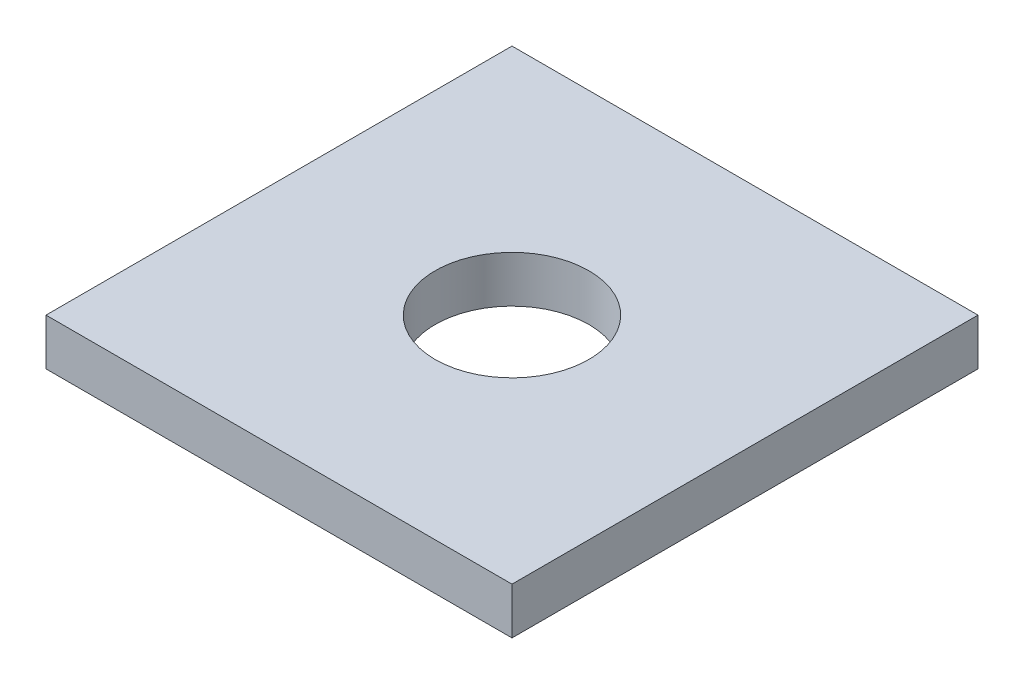
ISO-10303-21;
HEADER;
FILE_DESCRIPTION(('STEP AP214'),'2;1');
FILE_NAME('part.step','',(''),(''),'','','');
FILE_SCHEMA(('AUTOMOTIVE_DESIGN { 1 0 10303 214 1 1 1 1 }'));
ENDSEC;
DATA;
#1=APPLICATION_CONTEXT('core data for automotive mechanical design processes');
#2=APPLICATION_PROTOCOL_DEFINITION('international standard','automotive_design',2000,#1);
#3=PRODUCT_CONTEXT('',#1,'mechanical');
#4=PRODUCT('Part','Part','',(#3));
#5=PRODUCT_RELATED_PRODUCT_CATEGORY('part','',(#4));
#6=PRODUCT_DEFINITION_FORMATION('','',#4);
#7=PRODUCT_DEFINITION_CONTEXT('part definition',#1,'design');
#8=PRODUCT_DEFINITION('design','',#6,#7);
#9=PRODUCT_DEFINITION_SHAPE('','',#8);
#10=(LENGTH_UNIT() NAMED_UNIT(*) SI_UNIT(.MILLI.,.METRE.));
#11=(NAMED_UNIT(*) PLANE_ANGLE_UNIT() SI_UNIT($,.RADIAN.));
#12=(NAMED_UNIT(*) SI_UNIT($,.STERADIAN.) SOLID_ANGLE_UNIT());
#13=UNCERTAINTY_MEASURE_WITH_UNIT(LENGTH_MEASURE(1.E-05),#10,'distance_accuracy_value','');
#14=(GEOMETRIC_REPRESENTATION_CONTEXT(3) GLOBAL_UNCERTAINTY_ASSIGNED_CONTEXT((#13)) GLOBAL_UNIT_ASSIGNED_CONTEXT((#10,
#11,#12)) REPRESENTATION_CONTEXT('',''));
#15=CARTESIAN_POINT('',(0.,0.,0.));
#16=DIRECTION('',(0.,0.,1.));
#17=DIRECTION('',(1.,0.,0.));
#18=AXIS2_PLACEMENT_3D('',#15,#16,#17);
#19=CARTESIAN_POINT('',(0.,0.,0.));
#20=DIRECTION('',(0.,-1.,0.));
#21=DIRECTION('',(0.,0.,-1.));
#22=AXIS2_PLACEMENT_3D('',#19,#20,#21);
#23=PLANE('',#22);
#24=DIRECTION('',(0.,0.,-1.));
#25=VECTOR('',#24,1.);
#26=CARTESIAN_POINT('',(50.,0.,50.));
#27=LINE('',#26,#25);
#28=CARTESIAN_POINT('',(50.,0.,50.));
#29=VERTEX_POINT('',#28);
#30=CARTESIAN_POINT('',(50.,0.,-50.));
#31=VERTEX_POINT('',#30);
#32=EDGE_CURVE('E200',#29,#31,#27,.T.);
#33=ORIENTED_EDGE('',*,*,#32,.F.);
#34=DIRECTION('',(1.,0.,0.));
#35=VECTOR('',#34,1.);
#36=CARTESIAN_POINT('',(-50.,0.,50.));
#37=LINE('',#36,#35);
#38=CARTESIAN_POINT('',(-50.,0.,50.));
#39=VERTEX_POINT('',#38);
#40=EDGE_CURVE('E206',#39,#29,#37,.T.);
#41=ORIENTED_EDGE('',*,*,#40,.F.);
#42=DIRECTION('',(0.,0.,1.));
#43=VECTOR('',#42,1.);
#44=CARTESIAN_POINT('',(-50.,0.,50.));
#45=LINE('',#44,#43);
#46=CARTESIAN_POINT('',(-50.,0.,-50.));
#47=VERTEX_POINT('',#46);
#48=EDGE_CURVE('E220',#47,#39,#45,.T.);
#49=ORIENTED_EDGE('',*,*,#48,.F.);
#50=DIRECTION('',(-1.,0.,0.));
#51=VECTOR('',#50,1.);
#52=CARTESIAN_POINT('',(-50.,0.,-50.));
#53=LINE('',#52,#51);
#54=EDGE_CURVE('E214',#31,#47,#53,.T.);
#55=ORIENTED_EDGE('',*,*,#54,.F.);
#56=EDGE_LOOP('',(#33,#41,#49,#55));
#57=FACE_BOUND('',#56,.T.);
#58=DIRECTION('',(-1.,0.,0.));
#59=VECTOR('',#58,1.);
#60=CARTESIAN_POINT('',(-40.,0.,40.));
#61=LINE('',#60,#59);
#62=CARTESIAN_POINT('',(40.,0.,40.));
#63=VERTEX_POINT('',#62);
#64=CARTESIAN_POINT('',(-40.,0.,40.));
#65=VERTEX_POINT('',#64);
#66=EDGE_CURVE('E185',#63,#65,#61,.T.);
#67=ORIENTED_EDGE('',*,*,#66,.F.);
#68=DIRECTION('',(0.,0.,1.));
#69=VECTOR('',#68,1.);
#70=CARTESIAN_POINT('',(40.,0.,-40.));
#71=LINE('',#70,#69);
#72=CARTESIAN_POINT('',(40.,0.,-40.));
#73=VERTEX_POINT('',#72);
#74=EDGE_CURVE('E150',#73,#63,#71,.T.);
#75=ORIENTED_EDGE('',*,*,#74,.F.);
#76=DIRECTION('',(1.,0.,0.));
#77=VECTOR('',#76,1.);
#78=CARTESIAN_POINT('',(-40.,0.,-40.));
#79=LINE('',#78,#77);
#80=CARTESIAN_POINT('',(-40.,0.,-40.));
#81=VERTEX_POINT('',#80);
#82=EDGE_CURVE('E174',#81,#73,#79,.T.);
#83=ORIENTED_EDGE('',*,*,#82,.F.);
#84=DIRECTION('',(0.,0.,-1.));
#85=VECTOR('',#84,1.);
#86=CARTESIAN_POINT('',(-40.,0.,-40.));
#87=LINE('',#86,#85);
#88=EDGE_CURVE('E184',#65,#81,#87,.T.);
#89=ORIENTED_EDGE('',*,*,#88,.F.);
#90=EDGE_LOOP('',(#67,#75,#83,#89));
#91=FACE_BOUND('',#90,.T.);
#92=ADVANCED_FACE('F39',(#57,#91),#23,.T.);
#93=CARTESIAN_POINT('',(0.,10.,0.));
#94=DIRECTION('',(0.,-1.,0.));
#95=DIRECTION('',(0.,0.,-1.));
#96=AXIS2_PLACEMENT_3D('',#93,#94,#95);
#97=PLANE('',#96);
#98=DIRECTION('',(0.,0.,-1.));
#99=VECTOR('',#98,1.);
#100=CARTESIAN_POINT('',(50.,10.,50.));
#101=LINE('',#100,#99);
#102=CARTESIAN_POINT('',(50.,10.,50.));
#103=VERTEX_POINT('',#102);
#104=CARTESIAN_POINT('',(50.,10.,-50.));
#105=VERTEX_POINT('',#104);
#106=EDGE_CURVE('E205',#103,#105,#101,.T.);
#107=ORIENTED_EDGE('',*,*,#106,.T.);
#108=DIRECTION('',(-1.,0.,0.));
#109=VECTOR('',#108,1.);
#110=CARTESIAN_POINT('',(-50.,10.,-50.));
#111=LINE('',#110,#109);
#112=CARTESIAN_POINT('',(-50.,10.,-50.));
#113=VERTEX_POINT('',#112);
#114=EDGE_CURVE('E202',#105,#113,#111,.T.);
#115=ORIENTED_EDGE('',*,*,#114,.T.);
#116=DIRECTION('',(0.,0.,1.));
#117=VECTOR('',#116,1.);
#118=CARTESIAN_POINT('',(-50.,10.,50.));
#119=LINE('',#118,#117);
#120=CARTESIAN_POINT('',(-50.,10.,50.));
#121=VERTEX_POINT('',#120);
#122=EDGE_CURVE('E208',#113,#121,#119,.T.);
#123=ORIENTED_EDGE('',*,*,#122,.T.);
#124=DIRECTION('',(1.,0.,0.));
#125=VECTOR('',#124,1.);
#126=CARTESIAN_POINT('',(-50.,10.,50.));
#127=LINE('',#126,#125);
#128=EDGE_CURVE('E209',#121,#103,#127,.T.);
#129=ORIENTED_EDGE('',*,*,#128,.T.);
#130=EDGE_LOOP('',(#107,#115,#123,#129));
#131=FACE_BOUND('',#130,.T.);
#132=CARTESIAN_POINT('',(0.,10.,0.));
#133=DIRECTION('',(0.,1.,0.));
#134=DIRECTION('',(0.,0.,1.));
#135=AXIS2_PLACEMENT_3D('',#132,#133,#134);
#136=CIRCLE('',#135,16.5);
#137=CARTESIAN_POINT('',(0.,10.,16.5));
#138=VERTEX_POINT('',#137);
#139=EDGE_CURVE('E198',#138,#138,#136,.T.);
#140=ORIENTED_EDGE('',*,*,#139,.F.);
#141=EDGE_LOOP('',(#140));
#142=FACE_BOUND('',#141,.T.);
#143=ADVANCED_FACE('F241',(#131,#142),#97,.F.);
#144=DIRECTION('',(0.,0.,-1.));
#145=VECTOR('',#144,1.);
#146=CARTESIAN_POINT('',(-36.,0.,-36.));
#147=LINE('',#146,#145);
#148=CARTESIAN_POINT('',(-36.,0.,36.));
#149=VERTEX_POINT('',#148);
#150=CARTESIAN_POINT('',(-36.,0.,-36.));
#151=VERTEX_POINT('',#150);
#152=EDGE_CURVE('E65',#149,#151,#147,.T.);
#153=ORIENTED_EDGE('',*,*,#152,.T.);
#154=DIRECTION('',(1.,0.,0.));
#155=VECTOR('',#154,1.);
#156=CARTESIAN_POINT('',(-36.,0.,-36.));
#157=LINE('',#156,#155);
#158=CARTESIAN_POINT('',(36.,0.,-36.));
#159=VERTEX_POINT('',#158);
#160=EDGE_CURVE('E148',#151,#159,#157,.T.);
#161=ORIENTED_EDGE('',*,*,#160,.T.);
#162=DIRECTION('',(0.,0.,1.));
#163=VECTOR('',#162,1.);
#164=CARTESIAN_POINT('',(36.,0.,-36.));
#165=LINE('',#164,#163);
#166=CARTESIAN_POINT('',(36.,0.,36.));
#167=VERTEX_POINT('',#166);
#168=EDGE_CURVE('E161',#159,#167,#165,.T.);
#169=ORIENTED_EDGE('',*,*,#168,.T.);
#170=DIRECTION('',(-1.,0.,0.));
#171=VECTOR('',#170,1.);
#172=CARTESIAN_POINT('',(-36.,0.,36.));
#173=LINE('',#172,#171);
#174=EDGE_CURVE('E139',#167,#149,#173,.T.);
#175=ORIENTED_EDGE('',*,*,#174,.T.);
#176=EDGE_LOOP('',(#153,#161,#169,#175));
#177=FACE_BOUND('',#176,.T.);
#178=CARTESIAN_POINT('',(0.,0.,0.));
#179=DIRECTION('',(0.,1.,0.));
#180=DIRECTION('',(0.,0.,1.));
#181=AXIS2_PLACEMENT_3D('',#178,#179,#180);
#182=CIRCLE('',#181,16.5);
#183=CARTESIAN_POINT('',(0.,0.,16.5));
#184=VERTEX_POINT('',#183);
#185=EDGE_CURVE('E194',#184,#184,#182,.T.);
#186=ORIENTED_EDGE('',*,*,#185,.T.);
#187=EDGE_LOOP('',(#186));
#188=FACE_BOUND('',#187,.T.);
#189=ADVANCED_FACE('F251',(#177,#188),#23,.T.);
#190=CARTESIAN_POINT('',(50.,10.,50.));
#191=DIRECTION('',(-1.,0.,0.));
#192=DIRECTION('',(0.,0.,1.));
#193=AXIS2_PLACEMENT_3D('',#190,#191,#192);
#194=PLANE('',#193);
#195=ORIENTED_EDGE('',*,*,#32,.T.);
#196=DIRECTION('',(0.,-1.,0.));
#197=VECTOR('',#196,1.);
#198=CARTESIAN_POINT('',(50.,10.,-50.));
#199=LINE('',#198,#197);
#200=EDGE_CURVE('E11',#105,#31,#199,.T.);
#201=ORIENTED_EDGE('',*,*,#200,.F.);
#202=ORIENTED_EDGE('',*,*,#106,.F.);
#203=DIRECTION('',(0.,-1.,0.));
#204=VECTOR('',#203,1.);
#205=CARTESIAN_POINT('',(50.,10.,50.));
#206=LINE('',#205,#204);
#207=EDGE_CURVE('E215',#103,#29,#206,.T.);
#208=ORIENTED_EDGE('',*,*,#207,.T.);
#209=EDGE_LOOP('',(#195,#201,#202,#208));
#210=FACE_BOUND('',#209,.T.);
#211=ADVANCED_FACE('F41',(#210),#194,.F.);
#212=CARTESIAN_POINT('',(-50.,10.,-50.));
#213=DIRECTION('',(0.,0.,1.));
#214=DIRECTION('',(1.,0.,0.));
#215=AXIS2_PLACEMENT_3D('',#212,#213,#214);
#216=PLANE('',#215);
#217=ORIENTED_EDGE('',*,*,#54,.T.);
#218=DIRECTION('',(0.,-1.,0.));
#219=VECTOR('',#218,1.);
#220=CARTESIAN_POINT('',(-50.,10.,-50.));
#221=LINE('',#220,#219);
#222=EDGE_CURVE('E50',#113,#47,#221,.T.);
#223=ORIENTED_EDGE('',*,*,#222,.F.);
#224=ORIENTED_EDGE('',*,*,#114,.F.);
#225=ORIENTED_EDGE('',*,*,#200,.T.);
#226=EDGE_LOOP('',(#217,#223,#224,#225));
#227=FACE_BOUND('',#226,.T.);
#228=ADVANCED_FACE('F248',(#227),#216,.F.);
#229=CARTESIAN_POINT('',(-50.,10.,50.));
#230=DIRECTION('',(1.,0.,0.));
#231=DIRECTION('',(0.,0.,-1.));
#232=AXIS2_PLACEMENT_3D('',#229,#230,#231);
#233=PLANE('',#232);
#234=ORIENTED_EDGE('',*,*,#48,.T.);
#235=DIRECTION('',(0.,-1.,0.));
#236=VECTOR('',#235,1.);
#237=CARTESIAN_POINT('',(-50.,10.,50.));
#238=LINE('',#237,#236);
#239=EDGE_CURVE('E225',#121,#39,#238,.T.);
#240=ORIENTED_EDGE('',*,*,#239,.F.);
#241=ORIENTED_EDGE('',*,*,#122,.F.);
#242=ORIENTED_EDGE('',*,*,#222,.T.);
#243=EDGE_LOOP('',(#234,#240,#241,#242));
#244=FACE_BOUND('',#243,.T.);
#245=ADVANCED_FACE('F226',(#244),#233,.F.);
#246=CARTESIAN_POINT('',(-50.,10.,50.));
#247=DIRECTION('',(0.,0.,-1.));
#248=DIRECTION('',(-1.,0.,0.));
#249=AXIS2_PLACEMENT_3D('',#246,#247,#248);
#250=PLANE('',#249);
#251=ORIENTED_EDGE('',*,*,#40,.T.);
#252=ORIENTED_EDGE('',*,*,#207,.F.);
#253=ORIENTED_EDGE('',*,*,#128,.F.);
#254=ORIENTED_EDGE('',*,*,#239,.T.);
#255=EDGE_LOOP('',(#251,#252,#253,#254));
#256=FACE_BOUND('',#255,.T.);
#257=ADVANCED_FACE('F236',(#256),#250,.F.);
#258=CARTESIAN_POINT('',(0.,10.,0.));
#259=DIRECTION('',(0.,-1.,0.));
#260=DIRECTION('',(0.,0.,-1.));
#261=AXIS2_PLACEMENT_3D('',#258,#259,#260);
#262=CYLINDRICAL_SURFACE('',#261,16.5);
#263=ORIENTED_EDGE('',*,*,#139,.T.);
#264=EDGE_LOOP('',(#263));
#265=FACE_BOUND('',#264,.T.);
#266=ORIENTED_EDGE('',*,*,#185,.F.);
#267=EDGE_LOOP('',(#266));
#268=FACE_BOUND('',#267,.T.);
#269=ADVANCED_FACE('F267',(#265,#268),#262,.F.);
#270=CARTESIAN_POINT('',(0.,-10.,0.));
#271=DIRECTION('',(0.,1.,0.));
#272=DIRECTION('',(0.,0.,1.));
#273=AXIS2_PLACEMENT_3D('',#270,#271,#272);
#274=PLANE('',#273);
#275=DIRECTION('',(0.,0.,1.));
#276=VECTOR('',#275,1.);
#277=CARTESIAN_POINT('',(40.,-10.,-40.));
#278=LINE('',#277,#276);
#279=CARTESIAN_POINT('',(40.,-10.,-40.));
#280=VERTEX_POINT('',#279);
#281=CARTESIAN_POINT('',(40.,-10.,40.));
#282=VERTEX_POINT('',#281);
#283=EDGE_CURVE('E166',#280,#282,#278,.T.);
#284=ORIENTED_EDGE('',*,*,#283,.T.);
#285=DIRECTION('',(-1.,0.,0.));
#286=VECTOR('',#285,1.);
#287=CARTESIAN_POINT('',(-40.,-10.,40.));
#288=LINE('',#287,#286);
#289=CARTESIAN_POINT('',(-40.,-10.,40.));
#290=VERTEX_POINT('',#289);
#291=EDGE_CURVE('E175',#282,#290,#288,.T.);
#292=ORIENTED_EDGE('',*,*,#291,.T.);
#293=DIRECTION('',(0.,0.,-1.));
#294=VECTOR('',#293,1.);
#295=CARTESIAN_POINT('',(-40.,-10.,-40.));
#296=LINE('',#295,#294);
#297=CARTESIAN_POINT('',(-40.,-10.,-40.));
#298=VERTEX_POINT('',#297);
#299=EDGE_CURVE('E173',#290,#298,#296,.T.);
#300=ORIENTED_EDGE('',*,*,#299,.T.);
#301=DIRECTION('',(1.,0.,0.));
#302=VECTOR('',#301,1.);
#303=CARTESIAN_POINT('',(-40.,-10.,-40.));
#304=LINE('',#303,#302);
#305=EDGE_CURVE('E180',#298,#280,#304,.T.);
#306=ORIENTED_EDGE('',*,*,#305,.T.);
#307=EDGE_LOOP('',(#284,#292,#300,#306));
#308=FACE_BOUND('',#307,.T.);
#309=DIRECTION('',(0.,0.,-1.));
#310=VECTOR('',#309,1.);
#311=CARTESIAN_POINT('',(-36.,-10.,-36.));
#312=LINE('',#311,#310);
#313=CARTESIAN_POINT('',(-36.,-10.,36.));
#314=VERTEX_POINT('',#313);
#315=CARTESIAN_POINT('',(-36.,-10.,-36.));
#316=VERTEX_POINT('',#315);
#317=EDGE_CURVE('E128',#314,#316,#312,.T.);
#318=ORIENTED_EDGE('',*,*,#317,.F.);
#319=DIRECTION('',(-1.,0.,0.));
#320=VECTOR('',#319,1.);
#321=CARTESIAN_POINT('',(-36.,-10.,36.));
#322=LINE('',#321,#320);
#323=CARTESIAN_POINT('',(36.,-10.,36.));
#324=VERTEX_POINT('',#323);
#325=EDGE_CURVE('E154',#324,#314,#322,.T.);
#326=ORIENTED_EDGE('',*,*,#325,.F.);
#327=DIRECTION('',(0.,0.,1.));
#328=VECTOR('',#327,1.);
#329=CARTESIAN_POINT('',(36.,-10.,-36.));
#330=LINE('',#329,#328);
#331=CARTESIAN_POINT('',(36.,-10.,-36.));
#332=VERTEX_POINT('',#331);
#333=EDGE_CURVE('E153',#332,#324,#330,.T.);
#334=ORIENTED_EDGE('',*,*,#333,.F.);
#335=DIRECTION('',(1.,0.,0.));
#336=VECTOR('',#335,1.);
#337=CARTESIAN_POINT('',(-36.,-10.,-36.));
#338=LINE('',#337,#336);
#339=EDGE_CURVE('E137',#316,#332,#338,.T.);
#340=ORIENTED_EDGE('',*,*,#339,.F.);
#341=EDGE_LOOP('',(#318,#326,#334,#340));
#342=FACE_BOUND('',#341,.T.);
#343=ADVANCED_FACE('F151',(#308,#342),#274,.F.);
#344=CARTESIAN_POINT('',(40.,-10.,-40.));
#345=DIRECTION('',(-1.,0.,0.));
#346=DIRECTION('',(0.,0.,1.));
#347=AXIS2_PLACEMENT_3D('',#344,#345,#346);
#348=PLANE('',#347);
#349=ORIENTED_EDGE('',*,*,#74,.T.);
#350=DIRECTION('',(0.,1.,0.));
#351=VECTOR('',#350,1.);
#352=CARTESIAN_POINT('',(40.,-10.,40.));
#353=LINE('',#352,#351);
#354=EDGE_CURVE('E191',#282,#63,#353,.T.);
#355=ORIENTED_EDGE('',*,*,#354,.F.);
#356=ORIENTED_EDGE('',*,*,#283,.F.);
#357=DIRECTION('',(0.,1.,0.));
#358=VECTOR('',#357,1.);
#359=CARTESIAN_POINT('',(40.,-10.,-40.));
#360=LINE('',#359,#358);
#361=EDGE_CURVE('E177',#280,#73,#360,.T.);
#362=ORIENTED_EDGE('',*,*,#361,.T.);
#363=EDGE_LOOP('',(#349,#355,#356,#362));
#364=FACE_BOUND('',#363,.T.);
#365=ADVANCED_FACE('F274',(#364),#348,.F.);
#366=CARTESIAN_POINT('',(-40.,-10.,40.));
#367=DIRECTION('',(0.,0.,-1.));
#368=DIRECTION('',(-1.,0.,0.));
#369=AXIS2_PLACEMENT_3D('',#366,#367,#368);
#370=PLANE('',#369);
#371=ORIENTED_EDGE('',*,*,#66,.T.);
#372=DIRECTION('',(0.,1.,0.));
#373=VECTOR('',#372,1.);
#374=CARTESIAN_POINT('',(-40.,-10.,40.));
#375=LINE('',#374,#373);
#376=EDGE_CURVE('E188',#290,#65,#375,.T.);
#377=ORIENTED_EDGE('',*,*,#376,.F.);
#378=ORIENTED_EDGE('',*,*,#291,.F.);
#379=ORIENTED_EDGE('',*,*,#354,.T.);
#380=EDGE_LOOP('',(#371,#377,#378,#379));
#381=FACE_BOUND('',#380,.T.);
#382=ADVANCED_FACE('F282',(#381),#370,.F.);
#383=CARTESIAN_POINT('',(-40.,-10.,-40.));
#384=DIRECTION('',(1.,0.,0.));
#385=DIRECTION('',(0.,0.,-1.));
#386=AXIS2_PLACEMENT_3D('',#383,#384,#385);
#387=PLANE('',#386);
#388=ORIENTED_EDGE('',*,*,#88,.T.);
#389=DIRECTION('',(0.,1.,0.));
#390=VECTOR('',#389,1.);
#391=CARTESIAN_POINT('',(-40.,-10.,-40.));
#392=LINE('',#391,#390);
#393=EDGE_CURVE('E53',#298,#81,#392,.T.);
#394=ORIENTED_EDGE('',*,*,#393,.F.);
#395=ORIENTED_EDGE('',*,*,#299,.F.);
#396=ORIENTED_EDGE('',*,*,#376,.T.);
#397=EDGE_LOOP('',(#388,#394,#395,#396));
#398=FACE_BOUND('',#397,.T.);
#399=ADVANCED_FACE('F283',(#398),#387,.F.);
#400=CARTESIAN_POINT('',(-40.,-10.,-40.));
#401=DIRECTION('',(0.,0.,1.));
#402=DIRECTION('',(1.,0.,0.));
#403=AXIS2_PLACEMENT_3D('',#400,#401,#402);
#404=PLANE('',#403);
#405=ORIENTED_EDGE('',*,*,#82,.T.);
#406=ORIENTED_EDGE('',*,*,#361,.F.);
#407=ORIENTED_EDGE('',*,*,#305,.F.);
#408=ORIENTED_EDGE('',*,*,#393,.T.);
#409=EDGE_LOOP('',(#405,#406,#407,#408));
#410=FACE_BOUND('',#409,.T.);
#411=ADVANCED_FACE('F287',(#410),#404,.F.);
#412=CARTESIAN_POINT('',(-36.,-10.,-36.));
#413=DIRECTION('',(1.,0.,0.));
#414=DIRECTION('',(0.,0.,-1.));
#415=AXIS2_PLACEMENT_3D('',#412,#413,#414);
#416=PLANE('',#415);
#417=ORIENTED_EDGE('',*,*,#152,.F.);
#418=DIRECTION('',(0.,1.,0.));
#419=VECTOR('',#418,1.);
#420=CARTESIAN_POINT('',(-36.,-10.,36.));
#421=LINE('',#420,#419);
#422=EDGE_CURVE('E133',#314,#149,#421,.T.);
#423=ORIENTED_EDGE('',*,*,#422,.F.);
#424=ORIENTED_EDGE('',*,*,#317,.T.);
#425=DIRECTION('',(0.,1.,0.));
#426=VECTOR('',#425,1.);
#427=CARTESIAN_POINT('',(-36.,-10.,-36.));
#428=LINE('',#427,#426);
#429=EDGE_CURVE('E134',#316,#151,#428,.T.);
#430=ORIENTED_EDGE('',*,*,#429,.T.);
#431=EDGE_LOOP('',(#417,#423,#424,#430));
#432=FACE_BOUND('',#431,.T.);
#433=ADVANCED_FACE('F135',(#432),#416,.T.);
#434=CARTESIAN_POINT('',(-36.,-10.,-36.));
#435=DIRECTION('',(0.,0.,1.));
#436=DIRECTION('',(1.,0.,0.));
#437=AXIS2_PLACEMENT_3D('',#434,#435,#436);
#438=PLANE('',#437);
#439=ORIENTED_EDGE('',*,*,#160,.F.);
#440=ORIENTED_EDGE('',*,*,#429,.F.);
#441=ORIENTED_EDGE('',*,*,#339,.T.);
#442=DIRECTION('',(0.,1.,0.));
#443=VECTOR('',#442,1.);
#444=CARTESIAN_POINT('',(36.,-10.,-36.));
#445=LINE('',#444,#443);
#446=EDGE_CURVE('E146',#332,#159,#445,.T.);
#447=ORIENTED_EDGE('',*,*,#446,.T.);
#448=EDGE_LOOP('',(#439,#440,#441,#447));
#449=FACE_BOUND('',#448,.T.);
#450=ADVANCED_FACE('F141',(#449),#438,.T.);
#451=CARTESIAN_POINT('',(36.,-10.,-36.));
#452=DIRECTION('',(-1.,0.,0.));
#453=DIRECTION('',(0.,0.,1.));
#454=AXIS2_PLACEMENT_3D('',#451,#452,#453);
#455=PLANE('',#454);
#456=ORIENTED_EDGE('',*,*,#168,.F.);
#457=ORIENTED_EDGE('',*,*,#446,.F.);
#458=ORIENTED_EDGE('',*,*,#333,.T.);
#459=DIRECTION('',(0.,1.,0.));
#460=VECTOR('',#459,1.);
#461=CARTESIAN_POINT('',(36.,-10.,36.));
#462=LINE('',#461,#460);
#463=EDGE_CURVE('E164',#324,#167,#462,.T.);
#464=ORIENTED_EDGE('',*,*,#463,.T.);
#465=EDGE_LOOP('',(#456,#457,#458,#464));
#466=FACE_BOUND('',#465,.T.);
#467=ADVANCED_FACE('F300',(#466),#455,.T.);
#468=CARTESIAN_POINT('',(-36.,-10.,36.));
#469=DIRECTION('',(0.,0.,-1.));
#470=DIRECTION('',(-1.,0.,0.));
#471=AXIS2_PLACEMENT_3D('',#468,#469,#470);
#472=PLANE('',#471);
#473=ORIENTED_EDGE('',*,*,#174,.F.);
#474=ORIENTED_EDGE('',*,*,#463,.F.);
#475=ORIENTED_EDGE('',*,*,#325,.T.);
#476=ORIENTED_EDGE('',*,*,#422,.T.);
#477=EDGE_LOOP('',(#473,#474,#475,#476));
#478=FACE_BOUND('',#477,.T.);
#479=ADVANCED_FACE('F298',(#478),#472,.T.);
#480=CLOSED_SHELL('',(#92,#143,#189,#211,#228,#245,#257,#269,#343,#365,#382,#399,#411,#433,#450,
#467,#479));
#481=MANIFOLD_SOLID_BREP('B2',#480);
#482=ADVANCED_BREP_SHAPE_REPRESENTATION('',(#18,#481),#14);
#483=SHAPE_DEFINITION_REPRESENTATION(#9,#482);
ENDSEC;
END-ISO-10303-21;
